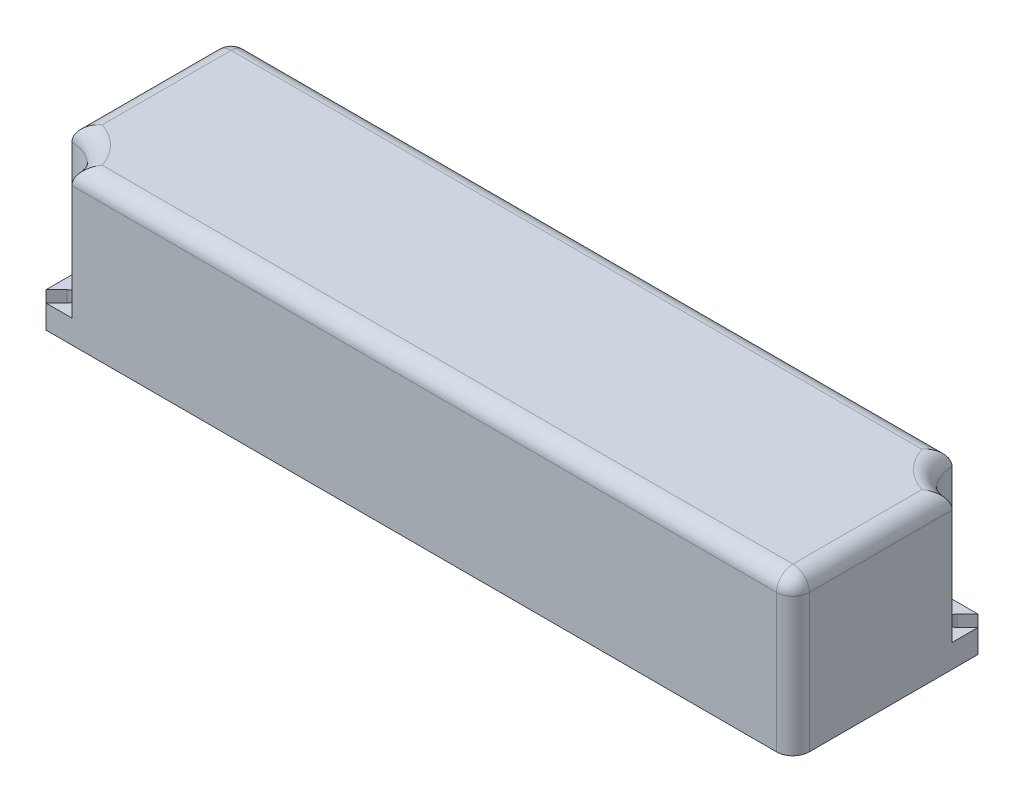
ISO-10303-21;
HEADER;
FILE_DESCRIPTION(('STEP AP214'),'2;1');
FILE_NAME('part.step','',(''),(''),'','','');
FILE_SCHEMA(('AUTOMOTIVE_DESIGN { 1 0 10303 214 1 1 1 1 }'));
ENDSEC;
DATA;
#1=APPLICATION_CONTEXT('core data for automotive mechanical design processes');
#2=APPLICATION_PROTOCOL_DEFINITION('international standard','automotive_design',2000,#1);
#3=PRODUCT_CONTEXT('',#1,'mechanical');
#4=PRODUCT('Part','Part','',(#3));
#5=PRODUCT_RELATED_PRODUCT_CATEGORY('part','',(#4));
#6=PRODUCT_DEFINITION_FORMATION('','',#4);
#7=PRODUCT_DEFINITION_CONTEXT('part definition',#1,'design');
#8=PRODUCT_DEFINITION('design','',#6,#7);
#9=PRODUCT_DEFINITION_SHAPE('','',#8);
#10=(LENGTH_UNIT() NAMED_UNIT(*) SI_UNIT(.MILLI.,.METRE.));
#11=(NAMED_UNIT(*) PLANE_ANGLE_UNIT() SI_UNIT($,.RADIAN.));
#12=(NAMED_UNIT(*) SI_UNIT($,.STERADIAN.) SOLID_ANGLE_UNIT());
#13=UNCERTAINTY_MEASURE_WITH_UNIT(LENGTH_MEASURE(1.E-05),#10,'distance_accuracy_value','');
#14=(GEOMETRIC_REPRESENTATION_CONTEXT(3) GLOBAL_UNCERTAINTY_ASSIGNED_CONTEXT((#13)) GLOBAL_UNIT_ASSIGNED_CONTEXT((#10,
#11,#12)) REPRESENTATION_CONTEXT('',''));
#15=CARTESIAN_POINT('',(0.,0.,0.));
#16=DIRECTION('',(0.,0.,1.));
#17=DIRECTION('',(1.,0.,0.));
#18=AXIS2_PLACEMENT_3D('',#15,#16,#17);
#19=CARTESIAN_POINT('',(-81.,33.,-21.));
#20=DIRECTION('',(1.,0.,0.));
#21=DIRECTION('',(0.,0.,-1.));
#22=AXIS2_PLACEMENT_3D('',#19,#20,#21);
#23=PLANE('',#22);
#24=DIRECTION('',(0.,0.,1.));
#25=VECTOR('',#24,1.);
#26=CARTESIAN_POINT('',(-81.,0.,-21.));
#27=LINE('',#26,#25);
#28=CARTESIAN_POINT('',(-81.,0.,-17.5));
#29=VERTEX_POINT('',#28);
#30=CARTESIAN_POINT('',(-81.,0.,18.5251262658471));
#31=VERTEX_POINT('',#30);
#32=EDGE_CURVE('E243',#29,#31,#27,.T.);
#33=ORIENTED_EDGE('',*,*,#32,.T.);
#34=DIRECTION('',(0.,1.,0.));
#35=VECTOR('',#34,1.);
#36=CARTESIAN_POINT('',(-81.,33.,18.5251262658471));
#37=LINE('',#36,#35);
#38=CARTESIAN_POINT('',(-81.,5.,18.5251262658471));
#39=VERTEX_POINT('',#38);
#40=EDGE_CURVE('E181',#31,#39,#37,.T.);
#41=ORIENTED_EDGE('',*,*,#40,.T.);
#42=DIRECTION('',(0.,0.,-1.));
#43=VECTOR('',#42,1.);
#44=CARTESIAN_POINT('',(-81.,5.,-21.));
#45=LINE('',#44,#43);
#46=CARTESIAN_POINT('',(-81.,5.,13.));
#47=VERTEX_POINT('',#46);
#48=EDGE_CURVE('E241',#39,#47,#45,.T.);
#49=ORIENTED_EDGE('',*,*,#48,.T.);
#50=DIRECTION('',(0.,1.,0.));
#51=VECTOR('',#50,1.);
#52=CARTESIAN_POINT('',(-81.,-22.6274169979695,13.));
#53=LINE('',#52,#51);
#54=CARTESIAN_POINT('',(-81.,29.5,13.));
#55=VERTEX_POINT('',#54);
#56=EDGE_CURVE('E238',#47,#55,#53,.T.);
#57=ORIENTED_EDGE('',*,*,#56,.T.);
#58=DIRECTION('',(0.,0.,1.));
#59=VECTOR('',#58,1.);
#60=CARTESIAN_POINT('',(-81.,29.5,-21.));
#61=LINE('',#60,#59);
#62=CARTESIAN_POINT('',(-81.,29.5,-17.5));
#63=VERTEX_POINT('',#62);
#64=EDGE_CURVE('E280',#55,#63,#61,.F.);
#65=ORIENTED_EDGE('',*,*,#64,.T.);
#66=DIRECTION('',(0.,-1.,0.));
#67=VECTOR('',#66,1.);
#68=CARTESIAN_POINT('',(-81.,33.,-17.5));
#69=LINE('',#68,#67);
#70=EDGE_CURVE('E278',#63,#29,#69,.T.);
#71=ORIENTED_EDGE('',*,*,#70,.T.);
#72=EDGE_LOOP('',(#33,#41,#49,#57,#65,#71));
#73=FACE_BOUND('',#72,.T.);
#74=ADVANCED_FACE('F35',(#73),#23,.F.);
#75=CARTESIAN_POINT('',(81.,33.,21.));
#76=DIRECTION('',(0.,0.,-1.));
#77=DIRECTION('',(-1.,0.,0.));
#78=AXIS2_PLACEMENT_3D('',#75,#76,#77);
#79=PLANE('',#78);
#80=DIRECTION('',(-1.,0.,0.));
#81=VECTOR('',#80,1.);
#82=CARTESIAN_POINT('',(81.,5.,21.));
#83=LINE('',#82,#81);
#84=CARTESIAN_POINT('',(-73.,5.,21.));
#85=VERTEX_POINT('',#84);
#86=CARTESIAN_POINT('',(-78.5251262658471,5.,21.));
#87=VERTEX_POINT('',#86);
#88=EDGE_CURVE('E252',#85,#87,#83,.T.);
#89=ORIENTED_EDGE('',*,*,#88,.T.);
#90=DIRECTION('',(0.,-1.,0.));
#91=VECTOR('',#90,1.);
#92=CARTESIAN_POINT('',(-78.5251262658471,33.,21.));
#93=LINE('',#92,#91);
#94=CARTESIAN_POINT('',(-78.5251262658471,0.,21.));
#95=VERTEX_POINT('',#94);
#96=EDGE_CURVE('E196',#87,#95,#93,.T.);
#97=ORIENTED_EDGE('',*,*,#96,.T.);
#98=DIRECTION('',(1.,0.,0.));
#99=VECTOR('',#98,1.);
#100=CARTESIAN_POINT('',(81.,0.,21.));
#101=LINE('',#100,#99);
#102=CARTESIAN_POINT('',(77.5,0.,21.));
#103=VERTEX_POINT('',#102);
#104=EDGE_CURVE('E245',#95,#103,#101,.T.);
#105=ORIENTED_EDGE('',*,*,#104,.T.);
#106=DIRECTION('',(0.,-1.,0.));
#107=VECTOR('',#106,1.);
#108=CARTESIAN_POINT('',(77.5,33.,21.));
#109=LINE('',#108,#107);
#110=CARTESIAN_POINT('',(77.5,29.5,21.));
#111=VERTEX_POINT('',#110);
#112=EDGE_CURVE('E271',#103,#111,#109,.F.);
#113=ORIENTED_EDGE('',*,*,#112,.T.);
#114=DIRECTION('',(1.,0.,0.));
#115=VECTOR('',#114,1.);
#116=CARTESIAN_POINT('',(81.,29.5,21.));
#117=LINE('',#116,#115);
#118=CARTESIAN_POINT('',(-73.,29.5,21.));
#119=VERTEX_POINT('',#118);
#120=EDGE_CURVE('E273',#111,#119,#117,.F.);
#121=ORIENTED_EDGE('',*,*,#120,.T.);
#122=DIRECTION('',(0.,1.,0.));
#123=VECTOR('',#122,1.);
#124=CARTESIAN_POINT('',(-73.,-22.6274169979695,21.));
#125=LINE('',#124,#123);
#126=EDGE_CURVE('E236',#119,#85,#125,.F.);
#127=ORIENTED_EDGE('',*,*,#126,.T.);
#128=EDGE_LOOP('',(#89,#97,#105,#113,#121,#127));
#129=FACE_BOUND('',#128,.T.);
#130=ADVANCED_FACE('F418',(#129),#79,.F.);
#131=CARTESIAN_POINT('',(81.,33.,-21.));
#132=DIRECTION('',(-1.,0.,0.));
#133=DIRECTION('',(0.,0.,1.));
#134=AXIS2_PLACEMENT_3D('',#131,#132,#133);
#135=PLANE('',#134);
#136=DIRECTION('',(0.,0.,-1.));
#137=VECTOR('',#136,1.);
#138=CARTESIAN_POINT('',(81.,0.,-21.));
#139=LINE('',#138,#137);
#140=CARTESIAN_POINT('',(81.,0.,17.5));
#141=VERTEX_POINT('',#140);
#142=CARTESIAN_POINT('',(81.,0.,-18.5251262658471));
#143=VERTEX_POINT('',#142);
#144=EDGE_CURVE('E247',#141,#143,#139,.T.);
#145=ORIENTED_EDGE('',*,*,#144,.T.);
#146=DIRECTION('',(0.,1.,0.));
#147=VECTOR('',#146,1.);
#148=CARTESIAN_POINT('',(81.,33.,-18.5251262658471));
#149=LINE('',#148,#147);
#150=CARTESIAN_POINT('',(81.,5.,-18.5251262658471));
#151=VERTEX_POINT('',#150);
#152=EDGE_CURVE('E214',#143,#151,#149,.T.);
#153=ORIENTED_EDGE('',*,*,#152,.T.);
#154=DIRECTION('',(0.,0.,1.));
#155=VECTOR('',#154,1.);
#156=CARTESIAN_POINT('',(81.,5.,-21.));
#157=LINE('',#156,#155);
#158=CARTESIAN_POINT('',(81.,5.,-13.));
#159=VERTEX_POINT('',#158);
#160=EDGE_CURVE('E231',#151,#159,#157,.T.);
#161=ORIENTED_EDGE('',*,*,#160,.T.);
#162=DIRECTION('',(0.,1.,0.));
#163=VECTOR('',#162,1.);
#164=CARTESIAN_POINT('',(81.,-22.6274169979695,-13.));
#165=LINE('',#164,#163);
#166=CARTESIAN_POINT('',(81.,29.5,-13.));
#167=VERTEX_POINT('',#166);
#168=EDGE_CURVE('E228',#159,#167,#165,.T.);
#169=ORIENTED_EDGE('',*,*,#168,.T.);
#170=DIRECTION('',(0.,0.,-1.));
#171=VECTOR('',#170,1.);
#172=CARTESIAN_POINT('',(81.,29.5,-21.));
#173=LINE('',#172,#171);
#174=CARTESIAN_POINT('',(81.,29.5,17.5));
#175=VERTEX_POINT('',#174);
#176=EDGE_CURVE('E290',#167,#175,#173,.F.);
#177=ORIENTED_EDGE('',*,*,#176,.T.);
#178=DIRECTION('',(0.,-1.,0.));
#179=VECTOR('',#178,1.);
#180=CARTESIAN_POINT('',(81.,33.,17.5));
#181=LINE('',#180,#179);
#182=EDGE_CURVE('E288',#175,#141,#181,.T.);
#183=ORIENTED_EDGE('',*,*,#182,.T.);
#184=EDGE_LOOP('',(#145,#153,#161,#169,#177,#183));
#185=FACE_BOUND('',#184,.T.);
#186=ADVANCED_FACE('F397',(#185),#135,.F.);
#187=CARTESIAN_POINT('',(81.,33.,-21.));
#188=DIRECTION('',(0.,0.,1.));
#189=DIRECTION('',(1.,0.,0.));
#190=AXIS2_PLACEMENT_3D('',#187,#188,#189);
#191=PLANE('',#190);
#192=DIRECTION('',(1.,0.,0.));
#193=VECTOR('',#192,1.);
#194=CARTESIAN_POINT('',(81.,5.,-21.));
#195=LINE('',#194,#193);
#196=CARTESIAN_POINT('',(73.,5.,-21.));
#197=VERTEX_POINT('',#196);
#198=CARTESIAN_POINT('',(78.5251262658471,5.,-21.));
#199=VERTEX_POINT('',#198);
#200=EDGE_CURVE('E255',#197,#199,#195,.T.);
#201=ORIENTED_EDGE('',*,*,#200,.T.);
#202=DIRECTION('',(0.,-1.,0.));
#203=VECTOR('',#202,1.);
#204=CARTESIAN_POINT('',(78.5251262658471,33.,-21.));
#205=LINE('',#204,#203);
#206=CARTESIAN_POINT('',(78.5251262658471,0.,-21.));
#207=VERTEX_POINT('',#206);
#208=EDGE_CURVE('E218',#199,#207,#205,.T.);
#209=ORIENTED_EDGE('',*,*,#208,.T.);
#210=DIRECTION('',(-1.,0.,0.));
#211=VECTOR('',#210,1.);
#212=CARTESIAN_POINT('',(81.,0.,-21.));
#213=LINE('',#212,#211);
#214=CARTESIAN_POINT('',(-77.5,0.,-21.));
#215=VERTEX_POINT('',#214);
#216=EDGE_CURVE('E250',#207,#215,#213,.T.);
#217=ORIENTED_EDGE('',*,*,#216,.T.);
#218=DIRECTION('',(0.,-1.,0.));
#219=VECTOR('',#218,1.);
#220=CARTESIAN_POINT('',(-77.5,33.,-21.));
#221=LINE('',#220,#219);
#222=CARTESIAN_POINT('',(-77.5,29.5,-21.));
#223=VERTEX_POINT('',#222);
#224=EDGE_CURVE('E282',#215,#223,#221,.F.);
#225=ORIENTED_EDGE('',*,*,#224,.T.);
#226=DIRECTION('',(-1.,0.,0.));
#227=VECTOR('',#226,1.);
#228=CARTESIAN_POINT('',(81.,29.5,-21.));
#229=LINE('',#228,#227);
#230=CARTESIAN_POINT('',(73.,29.5,-21.));
#231=VERTEX_POINT('',#230);
#232=EDGE_CURVE('E284',#223,#231,#229,.F.);
#233=ORIENTED_EDGE('',*,*,#232,.T.);
#234=DIRECTION('',(0.,1.,0.));
#235=VECTOR('',#234,1.);
#236=CARTESIAN_POINT('',(73.,-22.6274169979695,-21.));
#237=LINE('',#236,#235);
#238=EDGE_CURVE('E225',#231,#197,#237,.F.);
#239=ORIENTED_EDGE('',*,*,#238,.T.);
#240=EDGE_LOOP('',(#201,#209,#217,#225,#233,#239));
#241=FACE_BOUND('',#240,.T.);
#242=ADVANCED_FACE('F374',(#241),#191,.F.);
#243=CARTESIAN_POINT('',(0.,33.,0.));
#244=DIRECTION('',(0.,-1.,0.));
#245=DIRECTION('',(0.,0.,-1.));
#246=AXIS2_PLACEMENT_3D('',#243,#244,#245);
#247=PLANE('',#246);
#248=CARTESIAN_POINT('',(-81.,33.,21.));
#249=DIRECTION('',(0.,-1.,0.));
#250=DIRECTION('',(0.,0.,-1.));
#251=AXIS2_PLACEMENT_3D('',#248,#249,#250);
#252=CIRCLE('',#251,11.5);
#253=CARTESIAN_POINT('',(-77.5,33.,10.0455488498967));
#254=VERTEX_POINT('',#253);
#255=CARTESIAN_POINT('',(-70.0455488498967,33.,17.5));
#256=VERTEX_POINT('',#255);
#257=EDGE_CURVE('E266',#254,#256,#252,.T.);
#258=ORIENTED_EDGE('',*,*,#257,.T.);
#259=DIRECTION('',(1.,0.,0.));
#260=VECTOR('',#259,1.);
#261=CARTESIAN_POINT('',(0.,33.,17.5));
#262=LINE('',#261,#260);
#263=CARTESIAN_POINT('',(77.5,33.,17.5));
#264=VERTEX_POINT('',#263);
#265=EDGE_CURVE('E268',#256,#264,#262,.T.);
#266=ORIENTED_EDGE('',*,*,#265,.T.);
#267=DIRECTION('',(0.,0.,-1.));
#268=VECTOR('',#267,1.);
#269=CARTESIAN_POINT('',(77.5,33.,0.));
#270=LINE('',#269,#268);
#271=CARTESIAN_POINT('',(77.5,33.,-10.0455488498967));
#272=VERTEX_POINT('',#271);
#273=EDGE_CURVE('E258',#264,#272,#270,.T.);
#274=ORIENTED_EDGE('',*,*,#273,.T.);
#275=CARTESIAN_POINT('',(81.,33.,-21.));
#276=DIRECTION('',(0.,-1.,0.));
#277=DIRECTION('',(0.,0.,-1.));
#278=AXIS2_PLACEMENT_3D('',#275,#276,#277);
#279=CIRCLE('',#278,11.5);
#280=CARTESIAN_POINT('',(70.0455488498966,33.,-17.5));
#281=VERTEX_POINT('',#280);
#282=EDGE_CURVE('E260',#272,#281,#279,.T.);
#283=ORIENTED_EDGE('',*,*,#282,.T.);
#284=DIRECTION('',(-1.,0.,0.));
#285=VECTOR('',#284,1.);
#286=CARTESIAN_POINT('',(0.,33.,-17.5));
#287=LINE('',#286,#285);
#288=CARTESIAN_POINT('',(-77.5,33.,-17.5));
#289=VERTEX_POINT('',#288);
#290=EDGE_CURVE('E262',#281,#289,#287,.T.);
#291=ORIENTED_EDGE('',*,*,#290,.T.);
#292=DIRECTION('',(0.,0.,1.));
#293=VECTOR('',#292,1.);
#294=CARTESIAN_POINT('',(-77.5,33.,0.));
#295=LINE('',#294,#293);
#296=EDGE_CURVE('E264',#289,#254,#295,.T.);
#297=ORIENTED_EDGE('',*,*,#296,.T.);
#298=EDGE_LOOP('',(#258,#266,#274,#283,#291,#297));
#299=FACE_BOUND('',#298,.T.);
#300=ADVANCED_FACE('F430',(#299),#247,.F.);
#301=CARTESIAN_POINT('',(0.,0.,0.));
#302=DIRECTION('',(0.,-1.,0.));
#303=DIRECTION('',(0.,0.,-1.));
#304=AXIS2_PLACEMENT_3D('',#301,#302,#303);
#305=PLANE('',#304);
#306=DIRECTION('',(0.707106781186548,0.,-0.707106781186547));
#307=VECTOR('',#306,1.);
#308=CARTESIAN_POINT('',(-76.2625631329236,0.,18.7374368670765));
#309=LINE('',#308,#307);
#310=CARTESIAN_POINT('',(-76.2625631329236,0.,18.7374368670765));
#311=VERTEX_POINT('',#310);
#312=EDGE_CURVE('E175',#95,#311,#309,.T.);
#313=ORIENTED_EDGE('',*,*,#312,.T.);
#314=CARTESIAN_POINT('',(-77.5,0.,17.5));
#315=DIRECTION('',(0.,1.,0.));
#316=DIRECTION('',(0.,0.,1.));
#317=AXIS2_PLACEMENT_3D('',#314,#315,#316);
#318=CIRCLE('',#317,1.74999999999999);
#319=CARTESIAN_POINT('',(-78.7374368670765,0.,16.2625631329236));
#320=VERTEX_POINT('',#319);
#321=EDGE_CURVE('E170',#311,#320,#318,.T.);
#322=ORIENTED_EDGE('',*,*,#321,.T.);
#323=DIRECTION('',(-0.707106781186548,0.,0.707106781186547));
#324=VECTOR('',#323,1.);
#325=CARTESIAN_POINT('',(-78.7374368670765,0.,16.2625631329236));
#326=LINE('',#325,#324);
#327=EDGE_CURVE('E178',#320,#31,#326,.T.);
#328=ORIENTED_EDGE('',*,*,#327,.T.);
#329=ORIENTED_EDGE('',*,*,#32,.F.);
#330=CARTESIAN_POINT('',(-77.5,0.,-17.5));
#331=DIRECTION('',(0.,-1.,0.));
#332=DIRECTION('',(0.,0.,-1.));
#333=AXIS2_PLACEMENT_3D('',#330,#331,#332);
#334=CIRCLE('',#333,3.5);
#335=EDGE_CURVE('E295',#29,#215,#334,.T.);
#336=ORIENTED_EDGE('',*,*,#335,.T.);
#337=ORIENTED_EDGE('',*,*,#216,.F.);
#338=DIRECTION('',(-0.70710678118655,0.,0.707106781186545));
#339=VECTOR('',#338,1.);
#340=CARTESIAN_POINT('',(76.2625631329235,0.,-18.7374368670765));
#341=LINE('',#340,#339);
#342=CARTESIAN_POINT('',(76.2625631329235,0.,-18.7374368670765));
#343=VERTEX_POINT('',#342);
#344=EDGE_CURVE('E206',#207,#343,#341,.T.);
#345=ORIENTED_EDGE('',*,*,#344,.T.);
#346=CARTESIAN_POINT('',(77.5,0.,-17.5));
#347=DIRECTION('',(0.,1.,0.));
#348=DIRECTION('',(0.,0.,1.));
#349=AXIS2_PLACEMENT_3D('',#346,#347,#348);
#350=CIRCLE('',#349,1.75);
#351=CARTESIAN_POINT('',(78.7374368670764,0.,-16.2625631329236));
#352=VERTEX_POINT('',#351);
#353=EDGE_CURVE('E199',#343,#352,#350,.T.);
#354=ORIENTED_EDGE('',*,*,#353,.T.);
#355=DIRECTION('',(0.707106781186546,0.,-0.707106781186549));
#356=VECTOR('',#355,1.);
#357=CARTESIAN_POINT('',(78.7374368670764,0.,-16.2625631329236));
#358=LINE('',#357,#356);
#359=EDGE_CURVE('E202',#352,#143,#358,.T.);
#360=ORIENTED_EDGE('',*,*,#359,.T.);
#361=ORIENTED_EDGE('',*,*,#144,.F.);
#362=CARTESIAN_POINT('',(77.5,0.,17.5));
#363=DIRECTION('',(0.,-1.,0.));
#364=DIRECTION('',(0.,0.,-1.));
#365=AXIS2_PLACEMENT_3D('',#362,#363,#364);
#366=CIRCLE('',#365,3.5);
#367=EDGE_CURVE('E292',#141,#103,#366,.T.);
#368=ORIENTED_EDGE('',*,*,#367,.T.);
#369=ORIENTED_EDGE('',*,*,#104,.F.);
#370=EDGE_LOOP('',(#313,#322,#328,#329,#336,#337,#345,#354,#360,#361,#368,#369));
#371=FACE_BOUND('',#370,.T.);
#372=ADVANCED_FACE('F186',(#371),#305,.T.);
#373=CARTESIAN_POINT('',(0.,5.,0.));
#374=DIRECTION('',(0.,-1.,0.));
#375=DIRECTION('',(0.,0.,-1.));
#376=AXIS2_PLACEMENT_3D('',#373,#374,#375);
#377=PLANE('',#376);
#378=CARTESIAN_POINT('',(-77.5,5.,17.5));
#379=DIRECTION('',(0.,1.,0.));
#380=DIRECTION('',(0.,0.,1.));
#381=AXIS2_PLACEMENT_3D('',#378,#379,#380);
#382=CIRCLE('',#381,1.74999999999999);
#383=CARTESIAN_POINT('',(-76.2625631329236,5.,18.7374368670765));
#384=VERTEX_POINT('',#383);
#385=CARTESIAN_POINT('',(-78.7374368670765,5.,16.2625631329236));
#386=VERTEX_POINT('',#385);
#387=EDGE_CURVE('E50',#384,#386,#382,.T.);
#388=ORIENTED_EDGE('',*,*,#387,.F.);
#389=DIRECTION('',(-0.707106781186548,0.,0.707106781186547));
#390=VECTOR('',#389,1.);
#391=CARTESIAN_POINT('',(-28.7625631329235,5.,-28.7625631329235));
#392=LINE('',#391,#390);
#393=EDGE_CURVE('E12',#384,#87,#392,.T.);
#394=ORIENTED_EDGE('',*,*,#393,.T.);
#395=ORIENTED_EDGE('',*,*,#88,.F.);
#396=CARTESIAN_POINT('',(-81.,5.,21.));
#397=DIRECTION('',(0.,-1.,0.));
#398=DIRECTION('',(0.,0.,-1.));
#399=AXIS2_PLACEMENT_3D('',#396,#397,#398);
#400=CIRCLE('',#399,8.00000000000001);
#401=EDGE_CURVE('E233',#85,#47,#400,.F.);
#402=ORIENTED_EDGE('',*,*,#401,.T.);
#403=ORIENTED_EDGE('',*,*,#48,.F.);
#404=DIRECTION('',(-0.707106781186548,0.,0.707106781186547));
#405=VECTOR('',#404,1.);
#406=CARTESIAN_POINT('',(-78.7374368670765,5.,16.2625631329236));
#407=LINE('',#406,#405);
#408=EDGE_CURVE('E188',#386,#39,#407,.T.);
#409=ORIENTED_EDGE('',*,*,#408,.F.);
#410=EDGE_LOOP('',(#388,#394,#395,#402,#403,#409));
#411=FACE_BOUND('',#410,.T.);
#412=ADVANCED_FACE('F433',(#411),#377,.F.);
#413=CARTESIAN_POINT('',(-81.,-22.6274169979695,21.));
#414=DIRECTION('',(0.,1.,0.));
#415=DIRECTION('',(0.,0.,1.));
#416=AXIS2_PLACEMENT_3D('',#413,#414,#415);
#417=CYLINDRICAL_SURFACE('',#416,8.00000000000001);
#418=ORIENTED_EDGE('',*,*,#126,.F.);
#419=CARTESIAN_POINT('',(-81.,29.5,21.));
#420=DIRECTION('',(0.,-1.,0.));
#421=DIRECTION('',(0.,0.,-1.));
#422=AXIS2_PLACEMENT_3D('',#419,#420,#421);
#423=CIRCLE('',#422,8.00000000000001);
#424=EDGE_CURVE('E276',#119,#55,#423,.F.);
#425=ORIENTED_EDGE('',*,*,#424,.T.);
#426=ORIENTED_EDGE('',*,*,#56,.F.);
#427=ORIENTED_EDGE('',*,*,#401,.F.);
#428=EDGE_LOOP('',(#418,#425,#426,#427));
#429=FACE_BOUND('',#428,.T.);
#430=ADVANCED_FACE('F439',(#429),#417,.F.);
#431=CARTESIAN_POINT('',(0.,5.,0.));
#432=DIRECTION('',(0.,-1.,0.));
#433=DIRECTION('',(0.,0.,-1.));
#434=AXIS2_PLACEMENT_3D('',#431,#432,#433);
#435=PLANE('',#434);
#436=CARTESIAN_POINT('',(77.5,5.,-17.5));
#437=DIRECTION('',(0.,1.,0.));
#438=DIRECTION('',(0.,0.,1.));
#439=AXIS2_PLACEMENT_3D('',#436,#437,#438);
#440=CIRCLE('',#439,1.75);
#441=CARTESIAN_POINT('',(76.2625631329235,5.,-18.7374368670765));
#442=VERTEX_POINT('',#441);
#443=CARTESIAN_POINT('',(78.7374368670765,5.,-16.2625631329236));
#444=VERTEX_POINT('',#443);
#445=EDGE_CURVE('E58',#442,#444,#440,.T.);
#446=ORIENTED_EDGE('',*,*,#445,.F.);
#447=DIRECTION('',(0.70710678118655,0.,-0.707106781186545));
#448=VECTOR('',#447,1.);
#449=CARTESIAN_POINT('',(28.7625631329233,5.,28.7625631329235));
#450=LINE('',#449,#448);
#451=EDGE_CURVE('E43',#442,#199,#450,.T.);
#452=ORIENTED_EDGE('',*,*,#451,.T.);
#453=ORIENTED_EDGE('',*,*,#200,.F.);
#454=CARTESIAN_POINT('',(81.,5.,-21.));
#455=DIRECTION('',(0.,-1.,0.));
#456=DIRECTION('',(0.,0.,-1.));
#457=AXIS2_PLACEMENT_3D('',#454,#455,#456);
#458=CIRCLE('',#457,8.00000000000001);
#459=EDGE_CURVE('E222',#197,#159,#458,.F.);
#460=ORIENTED_EDGE('',*,*,#459,.T.);
#461=ORIENTED_EDGE('',*,*,#160,.F.);
#462=DIRECTION('',(0.707106781186546,0.,-0.707106781186549));
#463=VECTOR('',#462,1.);
#464=CARTESIAN_POINT('',(78.7374368670764,5.,-16.2625631329236));
#465=LINE('',#464,#463);
#466=EDGE_CURVE('E203',#444,#151,#465,.T.);
#467=ORIENTED_EDGE('',*,*,#466,.F.);
#468=EDGE_LOOP('',(#446,#452,#453,#460,#461,#467));
#469=FACE_BOUND('',#468,.T.);
#470=ADVANCED_FACE('F369',(#469),#435,.F.);
#471=CARTESIAN_POINT('',(81.,-22.6274169979695,-21.));
#472=DIRECTION('',(0.,1.,0.));
#473=DIRECTION('',(0.,0.,1.));
#474=AXIS2_PLACEMENT_3D('',#471,#472,#473);
#475=CYLINDRICAL_SURFACE('',#474,8.00000000000001);
#476=ORIENTED_EDGE('',*,*,#238,.F.);
#477=CARTESIAN_POINT('',(81.,29.5,-21.));
#478=DIRECTION('',(0.,-1.,0.));
#479=DIRECTION('',(0.,0.,-1.));
#480=AXIS2_PLACEMENT_3D('',#477,#478,#479);
#481=CIRCLE('',#480,8.00000000000001);
#482=EDGE_CURVE('E286',#231,#167,#481,.F.);
#483=ORIENTED_EDGE('',*,*,#482,.T.);
#484=ORIENTED_EDGE('',*,*,#168,.F.);
#485=ORIENTED_EDGE('',*,*,#459,.F.);
#486=EDGE_LOOP('',(#476,#483,#484,#485));
#487=FACE_BOUND('',#486,.T.);
#488=ADVANCED_FACE('F380',(#487),#475,.F.);
#489=CARTESIAN_POINT('',(-77.5,33.,-17.5));
#490=DIRECTION('',(0.,-1.,0.));
#491=DIRECTION('',(0.,0.,-1.));
#492=AXIS2_PLACEMENT_3D('',#489,#490,#491);
#493=CYLINDRICAL_SURFACE('',#492,3.5);
#494=ORIENTED_EDGE('',*,*,#335,.F.);
#495=ORIENTED_EDGE('',*,*,#70,.F.);
#496=CARTESIAN_POINT('',(-77.5,29.5,-17.5));
#497=DIRECTION('',(0.,1.,0.));
#498=DIRECTION('',(0.,0.,1.));
#499=AXIS2_PLACEMENT_3D('',#496,#497,#498);
#500=CIRCLE('',#499,3.5);
#501=EDGE_CURVE('E226',#223,#63,#500,.T.);
#502=ORIENTED_EDGE('',*,*,#501,.F.);
#503=ORIENTED_EDGE('',*,*,#224,.F.);
#504=EDGE_LOOP('',(#494,#495,#502,#503));
#505=FACE_BOUND('',#504,.T.);
#506=ADVANCED_FACE('F37',(#505),#493,.T.);
#507=CARTESIAN_POINT('',(0.,29.5,-17.5));
#508=DIRECTION('',(-1.,0.,0.));
#509=DIRECTION('',(0.,0.,1.));
#510=AXIS2_PLACEMENT_3D('',#507,#508,#509);
#511=CYLINDRICAL_SURFACE('',#510,3.5);
#512=CARTESIAN_POINT('',(73.,29.5,-21.));
#513=CARTESIAN_POINT('',(73.0000263534995,29.5798747810272,-21.0000207426085));
#514=CARTESIAN_POINT('',(72.9972665957739,29.6597307122141,-20.9972664988581));
#515=CARTESIAN_POINT('',(72.986377672172,29.8186306348513,-20.9863694096514));
#516=CARTESIAN_POINT('',(72.9782536824248,29.89767533449,-20.9782317588126));
#517=CARTESIAN_POINT('',(72.9569400981589,30.0535911638544,-20.9568307813397));
#518=CARTESIAN_POINT('',(72.9437993510836,30.1304758075527,-20.9436168739526));
#519=CARTESIAN_POINT('',(72.9128001332811,30.28227166343,-20.9123399948302));
#520=CARTESIAN_POINT('',(72.8949407725886,30.3571825004003,-20.8942761083425));
#521=CARTESIAN_POINT('',(72.8350329704631,30.5776685386868,-20.8334312772221));
#522=CARTESIAN_POINT('',(72.7865509860349,30.7197140488745,-20.78389444133));
#523=CARTESIAN_POINT('',(72.6758987184915,30.9919966365633,-20.6695252533713));
#524=CARTESIAN_POINT('',(72.6136915723484,31.1222005540164,-20.6046516756968));
#525=CARTESIAN_POINT('',(72.4492823979403,31.4240535373884,-20.4309101772882));
#526=CARTESIAN_POINT('',(72.3415193918804,31.5887634240935,-20.3152384712755));
#527=CARTESIAN_POINT('',(72.1121234272086,31.8908850364961,-20.0636787110158));
#528=CARTESIAN_POINT('',(71.9904651960865,32.028245734337,-19.9277536789739));
#529=CARTESIAN_POINT('',(71.7844578479344,32.2308309886419,-19.6925154696195));
#530=CARTESIAN_POINT('',(71.7026034812332,32.3041372009703,-19.5978316245288));
#531=CARTESIAN_POINT('',(71.5364191809027,32.439865499843,-19.4029724173245));
#532=CARTESIAN_POINT('',(71.4520885068598,32.5022842915342,-19.3027954048309));
#533=CARTESIAN_POINT('',(71.1967066318847,32.6731910052104,-18.9952649081079));
#534=CARTESIAN_POINT('',(71.0231069986245,32.7654817759374,-18.7807316548897));
#535=CARTESIAN_POINT('',(70.7155856127632,32.8894740254695,-18.3905489545252));
#536=CARTESIAN_POINT('',(70.5818547249172,32.9302872262932,-18.2175030615254));
#537=CARTESIAN_POINT('',(70.3157641927965,32.9852635055855,-17.8665442199787));
#538=CARTESIAN_POINT('',(70.1834021563282,32.9994857886904,-17.6886429807811));
#539=CARTESIAN_POINT('',(70.050315896161,32.9999954408783,-17.506526489254));
#540=CARTESIAN_POINT('',(70.0479320933702,33.0000000051899,-17.5032633980628));
#541=CARTESIAN_POINT('',(70.0455488498966,33.,-17.5));
#542=B_SPLINE_CURVE_WITH_KNOTS('',3,(#512,#513,#514,#515,#516,#517,#518,#519,#520,#521,#522,
#523,#524,#525,#526,#527,#528,#529,#530,#531,#532,#533,#534,#535,#536,#537,#538,#539,#540,#541),
.UNSPECIFIED.,.F.,.F.,(4,2,2,2,2,2,2,2,2,2,2,2,2,2,4),(0.,0.239498693005107,0.478766622674419,
0.715761919185068,0.952801946711446,1.42471685244023,1.89791499916974,2.57911030877004,
3.26156491530377,3.69619254377951,4.1309514759827,4.9996262720282,5.66566280625921,
6.33021463706153,6.34233785489257),.UNSPECIFIED.);
#543=EDGE_CURVE('E356',#231,#281,#542,.T.);
#544=ORIENTED_EDGE('',*,*,#543,.F.);
#545=ORIENTED_EDGE('',*,*,#232,.F.);
#546=CARTESIAN_POINT('',(-77.5,29.5,-17.5));
#547=DIRECTION('',(-1.,0.,0.));
#548=DIRECTION('',(0.,0.,1.));
#549=AXIS2_PLACEMENT_3D('',#546,#547,#548);
#550=CIRCLE('',#549,3.5);
#551=EDGE_CURVE('E362',#289,#223,#550,.T.);
#552=ORIENTED_EDGE('',*,*,#551,.F.);
#553=ORIENTED_EDGE('',*,*,#290,.F.);
#554=EDGE_LOOP('',(#544,#545,#552,#553));
#555=FACE_BOUND('',#554,.T.);
#556=ADVANCED_FACE('F353',(#555),#511,.T.);
#557=CARTESIAN_POINT('',(-77.5,29.5,-17.5));
#558=DIRECTION('',(0.,0.,1.));
#559=DIRECTION('',(1.,0.,0.));
#560=AXIS2_PLACEMENT_3D('',#557,#558,#559);
#561=SPHERICAL_SURFACE('',#560,3.5);
#562=ORIENTED_EDGE('',*,*,#551,.T.);
#563=ORIENTED_EDGE('',*,*,#501,.T.);
#564=CARTESIAN_POINT('',(-77.5,29.5,-17.5));
#565=DIRECTION('',(0.,0.,-1.));
#566=DIRECTION('',(-1.,0.,0.));
#567=AXIS2_PLACEMENT_3D('',#564,#565,#566);
#568=CIRCLE('',#567,3.5);
#569=EDGE_CURVE('E345',#289,#63,#568,.F.);
#570=ORIENTED_EDGE('',*,*,#569,.F.);
#571=EDGE_LOOP('',(#562,#563,#570));
#572=FACE_BOUND('',#571,.T.);
#573=ADVANCED_FACE('F351',(#572),#561,.T.);
#574=CARTESIAN_POINT('',(81.,29.5,-21.));
#575=DIRECTION('',(0.,-1.,0.));
#576=DIRECTION('',(0.,0.,-1.));
#577=AXIS2_PLACEMENT_3D('',#574,#575,#576);
#578=TOROIDAL_SURFACE('',#577,11.5,3.5);
#579=ORIENTED_EDGE('',*,*,#543,.T.);
#580=ORIENTED_EDGE('',*,*,#282,.F.);
#581=CARTESIAN_POINT('',(81.,29.5,-13.));
#582=CARTESIAN_POINT('',(81.0000207426085,29.5798747810272,-13.0000263534996));
#583=CARTESIAN_POINT('',(80.9972664988581,29.6597307122141,-12.997266595774));
#584=CARTESIAN_POINT('',(80.9863694096514,29.8186306348513,-12.986377672172));
#585=CARTESIAN_POINT('',(80.9782317588126,29.89767533449,-12.9782536824248));
#586=CARTESIAN_POINT('',(80.9568307813396,30.0535911638544,-12.956940098159));
#587=CARTESIAN_POINT('',(80.9436168739525,30.1304758075527,-12.9437993510836));
#588=CARTESIAN_POINT('',(80.9123399948301,30.28227166343,-12.9128001332812));
#589=CARTESIAN_POINT('',(80.8942761083425,30.3571825004003,-12.8949407725886));
#590=CARTESIAN_POINT('',(80.8334312772221,30.5776685386868,-12.8350329704631));
#591=CARTESIAN_POINT('',(80.7838944413299,30.7197140488745,-12.7865509860349));
#592=CARTESIAN_POINT('',(80.6695252533712,30.9919966365633,-12.6758987184915));
#593=CARTESIAN_POINT('',(80.6046516756968,31.1222005540164,-12.6136915723484));
#594=CARTESIAN_POINT('',(80.4309101772882,31.4240535373884,-12.4492823979403));
#595=CARTESIAN_POINT('',(80.3152384712754,31.5887634240935,-12.3415193918804));
#596=CARTESIAN_POINT('',(80.0636787110158,31.8908850364961,-12.1121234272087));
#597=CARTESIAN_POINT('',(79.9277536789738,32.028245734337,-11.9904651960865));
#598=CARTESIAN_POINT('',(79.6925154696195,32.2308309886419,-11.7844578479344));
#599=CARTESIAN_POINT('',(79.5978316245288,32.3041372009703,-11.7026034812332));
#600=CARTESIAN_POINT('',(79.4029724173245,32.439865499843,-11.5364191809027));
#601=CARTESIAN_POINT('',(79.3027954048308,32.5022842915342,-11.4520885068598));
#602=CARTESIAN_POINT('',(78.9952649081079,32.6731910052104,-11.1967066318847));
#603=CARTESIAN_POINT('',(78.7807316548896,32.7654817759374,-11.0231069986245));
#604=CARTESIAN_POINT('',(78.3905489545252,32.8894740254695,-10.7155856127631));
#605=CARTESIAN_POINT('',(78.2175030615255,32.9302872262932,-10.5818547249171));
#606=CARTESIAN_POINT('',(77.8665442199786,32.9852635055855,-10.3157641927966));
#607=CARTESIAN_POINT('',(77.6886429807808,32.9994857886904,-10.1834021563286));
#608=CARTESIAN_POINT('',(77.506526489254,32.9999954408783,-10.050315896161));
#609=CARTESIAN_POINT('',(77.5032633980628,33.0000000051899,-10.0479320933702));
#610=CARTESIAN_POINT('',(77.5,33.,-10.0455488498967));
#611=B_SPLINE_CURVE_WITH_KNOTS('',3,(#581,#582,#583,#584,#585,#586,#587,#588,#589,#590,#591,
#592,#593,#594,#595,#596,#597,#598,#599,#600,#601,#602,#603,#604,#605,#606,#607,#608,#609,#610),
.UNSPECIFIED.,.F.,.F.,(4,2,2,2,2,2,2,2,2,2,2,2,2,2,4),(0.,0.23949869300511,0.478766622674422,
0.715761919185073,0.952801946711445,1.42471685244022,1.89791499916975,2.57911030877005,
3.26156491530379,3.69619254377954,4.13095147598273,4.99962627202823,5.66566280625923,
6.33021463706154,6.34233785489257),.UNSPECIFIED.);
#612=EDGE_CURVE('E337',#167,#272,#611,.T.);
#613=ORIENTED_EDGE('',*,*,#612,.F.);
#614=ORIENTED_EDGE('',*,*,#482,.F.);
#615=EDGE_LOOP('',(#579,#580,#613,#614));
#616=FACE_BOUND('',#615,.T.);
#617=ADVANCED_FACE('F326',(#616),#578,.T.);
#618=CARTESIAN_POINT('',(-77.5,29.5,0.));
#619=DIRECTION('',(0.,0.,1.));
#620=DIRECTION('',(1.,0.,0.));
#621=AXIS2_PLACEMENT_3D('',#618,#619,#620);
#622=CYLINDRICAL_SURFACE('',#621,3.5);
#623=ORIENTED_EDGE('',*,*,#569,.T.);
#624=ORIENTED_EDGE('',*,*,#64,.F.);
#625=CARTESIAN_POINT('',(-81.,29.5,13.));
#626=CARTESIAN_POINT('',(-81.0000207426085,29.5798747810272,13.0000263534995));
#627=CARTESIAN_POINT('',(-80.9972664988581,29.6597307122141,12.9972665957739));
#628=CARTESIAN_POINT('',(-80.9863694096514,29.8186306348513,12.986377672172));
#629=CARTESIAN_POINT('',(-80.9782317588126,29.89767533449,12.9782536824248));
#630=CARTESIAN_POINT('',(-80.9568307813396,30.0535911638544,12.956940098159));
#631=CARTESIAN_POINT('',(-80.9436168739525,30.1304758075527,12.9437993510836));
#632=CARTESIAN_POINT('',(-80.9123399948302,30.28227166343,12.9128001332811));
#633=CARTESIAN_POINT('',(-80.8942761083425,30.3571825004003,12.8949407725886));
#634=CARTESIAN_POINT('',(-80.8334312772221,30.5776685386868,12.8350329704631));
#635=CARTESIAN_POINT('',(-80.78389444133,30.7197140488745,12.7865509860349));
#636=CARTESIAN_POINT('',(-80.6695252533713,30.9919966365633,12.6758987184915));
#637=CARTESIAN_POINT('',(-80.6046516756968,31.1222005540164,12.6136915723484));
#638=CARTESIAN_POINT('',(-80.4309101772882,31.4240535373884,12.4492823979403));
#639=CARTESIAN_POINT('',(-80.3152384712755,31.5887634240935,12.3415193918804));
#640=CARTESIAN_POINT('',(-80.0636787110158,31.8908850364961,12.1121234272086));
#641=CARTESIAN_POINT('',(-79.9277536789738,32.028245734337,11.9904651960865));
#642=CARTESIAN_POINT('',(-79.6925154696195,32.2308309886419,11.7844578479344));
#643=CARTESIAN_POINT('',(-79.5978316245288,32.3041372009703,11.7026034812332));
#644=CARTESIAN_POINT('',(-79.4029724173245,32.439865499843,11.5364191809027));
#645=CARTESIAN_POINT('',(-79.3027954048309,32.5022842915342,11.4520885068598));
#646=CARTESIAN_POINT('',(-78.9952649081079,32.6731910052104,11.1967066318847));
#647=CARTESIAN_POINT('',(-78.7807316548896,32.7654817759374,11.0231069986245));
#648=CARTESIAN_POINT('',(-78.3905489545252,32.8894740254695,10.7155856127631));
#649=CARTESIAN_POINT('',(-78.2175030615255,32.9302872262932,10.5818547249171));
#650=CARTESIAN_POINT('',(-77.8665442199786,32.9852635055855,10.3157641927966));
#651=CARTESIAN_POINT('',(-77.6886429807808,32.9994857886904,10.1834021563285));
#652=CARTESIAN_POINT('',(-77.506526489254,32.9999954408783,10.050315896161));
#653=CARTESIAN_POINT('',(-77.5032633980628,33.0000000051899,10.0479320933702));
#654=CARTESIAN_POINT('',(-77.5,33.,10.0455488498967));
#655=B_SPLINE_CURVE_WITH_KNOTS('',3,(#625,#626,#627,#628,#629,#630,#631,#632,#633,#634,#635,
#636,#637,#638,#639,#640,#641,#642,#643,#644,#645,#646,#647,#648,#649,#650,#651,#652,#653,#654),
.UNSPECIFIED.,.F.,.F.,(4,2,2,2,2,2,2,2,2,2,2,2,2,2,4),(0.,0.23949869300511,0.478766622674422,
0.715761919185073,0.952801946711445,1.42471685244023,1.89791499916975,2.57911030877005,
3.26156491530379,3.69619254377954,4.13095147598273,4.99962627202823,5.66566280625923,
6.33021463706154,6.34233785489257),.UNSPECIFIED.);
#656=EDGE_CURVE('E331',#254,#55,#655,.F.);
#657=ORIENTED_EDGE('',*,*,#656,.F.);
#658=ORIENTED_EDGE('',*,*,#296,.F.);
#659=EDGE_LOOP('',(#623,#624,#657,#658));
#660=FACE_BOUND('',#659,.T.);
#661=ADVANCED_FACE('F321',(#660),#622,.T.);
#662=CARTESIAN_POINT('',(77.5,29.5,0.));
#663=DIRECTION('',(0.,0.,-1.));
#664=DIRECTION('',(-1.,0.,0.));
#665=AXIS2_PLACEMENT_3D('',#662,#663,#664);
#666=CYLINDRICAL_SURFACE('',#665,3.5);
#667=ORIENTED_EDGE('',*,*,#612,.T.);
#668=ORIENTED_EDGE('',*,*,#273,.F.);
#669=CARTESIAN_POINT('',(77.5,29.5,17.5));
#670=DIRECTION('',(0.,0.,1.));
#671=DIRECTION('',(0.,-1.,0.));
#672=AXIS2_PLACEMENT_3D('',#669,#670,#671);
#673=CIRCLE('',#672,3.5);
#674=EDGE_CURVE('E338',#175,#264,#673,.T.);
#675=ORIENTED_EDGE('',*,*,#674,.F.);
#676=ORIENTED_EDGE('',*,*,#176,.F.);
#677=EDGE_LOOP('',(#667,#668,#675,#676));
#678=FACE_BOUND('',#677,.T.);
#679=ADVANCED_FACE('F325',(#678),#666,.T.);
#680=CARTESIAN_POINT('',(77.5,33.,17.5));
#681=DIRECTION('',(0.,-1.,0.));
#682=DIRECTION('',(0.,0.,-1.));
#683=AXIS2_PLACEMENT_3D('',#680,#681,#682);
#684=CYLINDRICAL_SURFACE('',#683,3.5);
#685=ORIENTED_EDGE('',*,*,#367,.F.);
#686=ORIENTED_EDGE('',*,*,#182,.F.);
#687=CARTESIAN_POINT('',(77.5,29.5,17.5));
#688=DIRECTION('',(0.,1.,0.));
#689=DIRECTION('',(0.,0.,1.));
#690=AXIS2_PLACEMENT_3D('',#687,#688,#689);
#691=CIRCLE('',#690,3.5);
#692=EDGE_CURVE('E306',#111,#175,#691,.T.);
#693=ORIENTED_EDGE('',*,*,#692,.F.);
#694=ORIENTED_EDGE('',*,*,#112,.F.);
#695=EDGE_LOOP('',(#685,#686,#693,#694));
#696=FACE_BOUND('',#695,.T.);
#697=ADVANCED_FACE('F328',(#696),#684,.T.);
#698=CARTESIAN_POINT('',(-81.,29.5,21.));
#699=DIRECTION('',(0.,-1.,0.));
#700=DIRECTION('',(0.,0.,-1.));
#701=AXIS2_PLACEMENT_3D('',#698,#699,#700);
#702=TOROIDAL_SURFACE('',#701,11.5,3.5);
#703=ORIENTED_EDGE('',*,*,#656,.T.);
#704=ORIENTED_EDGE('',*,*,#424,.F.);
#705=CARTESIAN_POINT('',(-73.,29.5,21.));
#706=CARTESIAN_POINT('',(-73.0000263534996,29.5798747810272,21.0000207426085));
#707=CARTESIAN_POINT('',(-72.997266595774,29.6597307122141,20.9972664988581));
#708=CARTESIAN_POINT('',(-72.986377672172,29.8186306348513,20.9863694096514));
#709=CARTESIAN_POINT('',(-72.9782536824248,29.89767533449,20.9782317588126));
#710=CARTESIAN_POINT('',(-72.956940098159,30.0535911638544,20.9568307813397));
#711=CARTESIAN_POINT('',(-72.9437993510836,30.1304758075527,20.9436168739525));
#712=CARTESIAN_POINT('',(-72.9128001332812,30.28227166343,20.9123399948302));
#713=CARTESIAN_POINT('',(-72.8949407725886,30.3571825004003,20.8942761083425));
#714=CARTESIAN_POINT('',(-72.8350329704631,30.5776685386868,20.8334312772221));
#715=CARTESIAN_POINT('',(-72.7865509860349,30.7197140488745,20.78389444133));
#716=CARTESIAN_POINT('',(-72.6758987184915,30.9919966365633,20.6695252533713));
#717=CARTESIAN_POINT('',(-72.6136915723484,31.1222005540164,20.6046516756968));
#718=CARTESIAN_POINT('',(-72.4492823979403,31.4240535373884,20.4309101772882));
#719=CARTESIAN_POINT('',(-72.3415193918804,31.5887634240935,20.3152384712755));
#720=CARTESIAN_POINT('',(-72.1121234272087,31.8908850364961,20.0636787110158));
#721=CARTESIAN_POINT('',(-71.9904651960865,32.028245734337,19.9277536789739));
#722=CARTESIAN_POINT('',(-71.7844578479344,32.2308309886419,19.6925154696195));
#723=CARTESIAN_POINT('',(-71.7026034812332,32.3041372009703,19.5978316245288));
#724=CARTESIAN_POINT('',(-71.5364191809027,32.439865499843,19.4029724173245));
#725=CARTESIAN_POINT('',(-71.4520885068598,32.5022842915342,19.3027954048309));
#726=CARTESIAN_POINT('',(-71.1967066318847,32.6731910052104,18.9952649081079));
#727=CARTESIAN_POINT('',(-71.0231069986245,32.7654817759374,18.7807316548897));
#728=CARTESIAN_POINT('',(-70.7155856127632,32.8894740254695,18.3905489545252));
#729=CARTESIAN_POINT('',(-70.5818547249172,32.9302872262932,18.2175030615254));
#730=CARTESIAN_POINT('',(-70.3157641927965,32.9852635055855,17.8665442199787));
#731=CARTESIAN_POINT('',(-70.1834021563282,32.9994857886904,17.6886429807811));
#732=CARTESIAN_POINT('',(-70.050315896161,32.9999954408783,17.506526489254));
#733=CARTESIAN_POINT('',(-70.0479320933702,33.0000000051899,17.5032633980628));
#734=CARTESIAN_POINT('',(-70.0455488498967,33.,17.5));
#735=B_SPLINE_CURVE_WITH_KNOTS('',3,(#705,#706,#707,#708,#709,#710,#711,#712,#713,#714,#715,
#716,#717,#718,#719,#720,#721,#722,#723,#724,#725,#726,#727,#728,#729,#730,#731,#732,#733,#734),
.UNSPECIFIED.,.F.,.F.,(4,2,2,2,2,2,2,2,2,2,2,2,2,2,4),(0.,0.239498693005107,0.478766622674419,
0.715761919185068,0.952801946711446,1.42471685244023,1.89791499916974,2.57911030877004,
3.26156491530377,3.69619254377951,4.1309514759827,4.9996262720282,5.66566280625921,
6.33021463706153,6.34233785489257),.UNSPECIFIED.);
#736=EDGE_CURVE('E299',#256,#119,#735,.F.);
#737=ORIENTED_EDGE('',*,*,#736,.F.);
#738=ORIENTED_EDGE('',*,*,#257,.F.);
#739=EDGE_LOOP('',(#703,#704,#737,#738));
#740=FACE_BOUND('',#739,.T.);
#741=ADVANCED_FACE('F308',(#740),#702,.T.);
#742=CARTESIAN_POINT('',(77.5,29.5,17.5));
#743=DIRECTION('',(0.,0.,1.));
#744=DIRECTION('',(1.,0.,0.));
#745=AXIS2_PLACEMENT_3D('',#742,#743,#744);
#746=SPHERICAL_SURFACE('',#745,3.5);
#747=ORIENTED_EDGE('',*,*,#692,.T.);
#748=ORIENTED_EDGE('',*,*,#674,.T.);
#749=CARTESIAN_POINT('',(77.5,29.5,17.5));
#750=DIRECTION('',(1.,0.,0.));
#751=DIRECTION('',(0.,0.,-1.));
#752=AXIS2_PLACEMENT_3D('',#749,#750,#751);
#753=CIRCLE('',#752,3.5);
#754=EDGE_CURVE('E221',#111,#264,#753,.F.);
#755=ORIENTED_EDGE('',*,*,#754,.F.);
#756=EDGE_LOOP('',(#747,#748,#755));
#757=FACE_BOUND('',#756,.T.);
#758=ADVANCED_FACE('F316',(#757),#746,.T.);
#759=CARTESIAN_POINT('',(0.,29.5,17.5));
#760=DIRECTION('',(1.,0.,0.));
#761=DIRECTION('',(0.,0.,-1.));
#762=AXIS2_PLACEMENT_3D('',#759,#760,#761);
#763=CYLINDRICAL_SURFACE('',#762,3.5);
#764=ORIENTED_EDGE('',*,*,#736,.T.);
#765=ORIENTED_EDGE('',*,*,#120,.F.);
#766=ORIENTED_EDGE('',*,*,#754,.T.);
#767=ORIENTED_EDGE('',*,*,#265,.F.);
#768=EDGE_LOOP('',(#764,#765,#766,#767));
#769=FACE_BOUND('',#768,.T.);
#770=ADVANCED_FACE('F311',(#769),#763,.T.);
#771=CARTESIAN_POINT('',(76.2625631329235,0.,-18.7374368670765));
#772=DIRECTION('',(-0.707106781186545,0.,-0.70710678118655));
#773=DIRECTION('',(-0.70710678118655,0.,0.707106781186545));
#774=AXIS2_PLACEMENT_3D('',#771,#772,#773);
#775=PLANE('',#774);
#776=ORIENTED_EDGE('',*,*,#451,.F.);
#777=DIRECTION('',(0.,1.,0.));
#778=VECTOR('',#777,1.);
#779=CARTESIAN_POINT('',(76.2625631329235,0.,-18.7374368670765));
#780=LINE('',#779,#778);
#781=EDGE_CURVE('E212',#343,#442,#780,.T.);
#782=ORIENTED_EDGE('',*,*,#781,.F.);
#783=ORIENTED_EDGE('',*,*,#344,.F.);
#784=ORIENTED_EDGE('',*,*,#208,.F.);
#785=EDGE_LOOP('',(#776,#782,#783,#784));
#786=FACE_BOUND('',#785,.T.);
#787=ADVANCED_FACE('F315',(#786),#775,.F.);
#788=CARTESIAN_POINT('',(78.7374368670764,0.,-16.2625631329236));
#789=DIRECTION('',(0.707106781186549,0.,0.707106781186546));
#790=DIRECTION('',(0.707106781186546,0.,-0.707106781186549));
#791=AXIS2_PLACEMENT_3D('',#788,#789,#790);
#792=PLANE('',#791);
#793=ORIENTED_EDGE('',*,*,#359,.F.);
#794=DIRECTION('',(0.,1.,0.));
#795=VECTOR('',#794,1.);
#796=CARTESIAN_POINT('',(78.7374368670764,0.,-16.2625631329236));
#797=LINE('',#796,#795);
#798=EDGE_CURVE('E209',#352,#444,#797,.T.);
#799=ORIENTED_EDGE('',*,*,#798,.T.);
#800=ORIENTED_EDGE('',*,*,#466,.T.);
#801=ORIENTED_EDGE('',*,*,#152,.F.);
#802=EDGE_LOOP('',(#793,#799,#800,#801));
#803=FACE_BOUND('',#802,.T.);
#804=ADVANCED_FACE('F407',(#803),#792,.F.);
#805=CARTESIAN_POINT('',(77.5,0.,-17.5));
#806=DIRECTION('',(0.,1.,0.));
#807=DIRECTION('',(0.,0.,1.));
#808=AXIS2_PLACEMENT_3D('',#805,#806,#807);
#809=CYLINDRICAL_SURFACE('',#808,1.75);
#810=ORIENTED_EDGE('',*,*,#445,.T.);
#811=ORIENTED_EDGE('',*,*,#798,.F.);
#812=ORIENTED_EDGE('',*,*,#353,.F.);
#813=ORIENTED_EDGE('',*,*,#781,.T.);
#814=EDGE_LOOP('',(#810,#811,#812,#813));
#815=FACE_BOUND('',#814,.T.);
#816=ADVANCED_FACE('F409',(#815),#809,.F.);
#817=CARTESIAN_POINT('',(-76.2625631329236,0.,18.7374368670765));
#818=DIRECTION('',(0.707106781186547,0.,0.707106781186548));
#819=DIRECTION('',(0.707106781186548,0.,-0.707106781186547));
#820=AXIS2_PLACEMENT_3D('',#817,#818,#819);
#821=PLANE('',#820);
#822=ORIENTED_EDGE('',*,*,#393,.F.);
#823=DIRECTION('',(0.,1.,0.));
#824=VECTOR('',#823,1.);
#825=CARTESIAN_POINT('',(-76.2625631329236,0.,18.7374368670765));
#826=LINE('',#825,#824);
#827=EDGE_CURVE('E174',#311,#384,#826,.T.);
#828=ORIENTED_EDGE('',*,*,#827,.F.);
#829=ORIENTED_EDGE('',*,*,#312,.F.);
#830=ORIENTED_EDGE('',*,*,#96,.F.);
#831=EDGE_LOOP('',(#822,#828,#829,#830));
#832=FACE_BOUND('',#831,.T.);
#833=ADVANCED_FACE('F449',(#832),#821,.F.);
#834=CARTESIAN_POINT('',(-78.7374368670765,0.,16.2625631329236));
#835=DIRECTION('',(-0.707106781186547,0.,-0.707106781186548));
#836=DIRECTION('',(-0.707106781186548,0.,0.707106781186547));
#837=AXIS2_PLACEMENT_3D('',#834,#835,#836);
#838=PLANE('',#837);
#839=ORIENTED_EDGE('',*,*,#327,.F.);
#840=DIRECTION('',(0.,1.,0.));
#841=VECTOR('',#840,1.);
#842=CARTESIAN_POINT('',(-78.7374368670765,0.,16.2625631329236));
#843=LINE('',#842,#841);
#844=EDGE_CURVE('E166',#320,#386,#843,.T.);
#845=ORIENTED_EDGE('',*,*,#844,.T.);
#846=ORIENTED_EDGE('',*,*,#408,.T.);
#847=ORIENTED_EDGE('',*,*,#40,.F.);
#848=EDGE_LOOP('',(#839,#845,#846,#847));
#849=FACE_BOUND('',#848,.T.);
#850=ADVANCED_FACE('F179',(#849),#838,.F.);
#851=CARTESIAN_POINT('',(-77.5,0.,17.5));
#852=DIRECTION('',(0.,1.,0.));
#853=DIRECTION('',(0.,0.,1.));
#854=AXIS2_PLACEMENT_3D('',#851,#852,#853);
#855=CYLINDRICAL_SURFACE('',#854,1.74999999999999);
#856=ORIENTED_EDGE('',*,*,#387,.T.);
#857=ORIENTED_EDGE('',*,*,#844,.F.);
#858=ORIENTED_EDGE('',*,*,#321,.F.);
#859=ORIENTED_EDGE('',*,*,#827,.T.);
#860=EDGE_LOOP('',(#856,#857,#858,#859));
#861=FACE_BOUND('',#860,.T.);
#862=ADVANCED_FACE('F168',(#861),#855,.F.);
#863=CLOSED_SHELL('',(#74,#130,#186,#242,#300,#372,#412,#430,#470,#488,#506,#556,#573,#617,#661,
#679,#697,#741,#758,#770,#787,#804,#816,#833,#850,#862));
#864=MANIFOLD_SOLID_BREP('B2',#863);
#865=ADVANCED_BREP_SHAPE_REPRESENTATION('',(#18,#864),#14);
#866=SHAPE_DEFINITION_REPRESENTATION(#9,#865);
ENDSEC;
END-ISO-10303-21;
